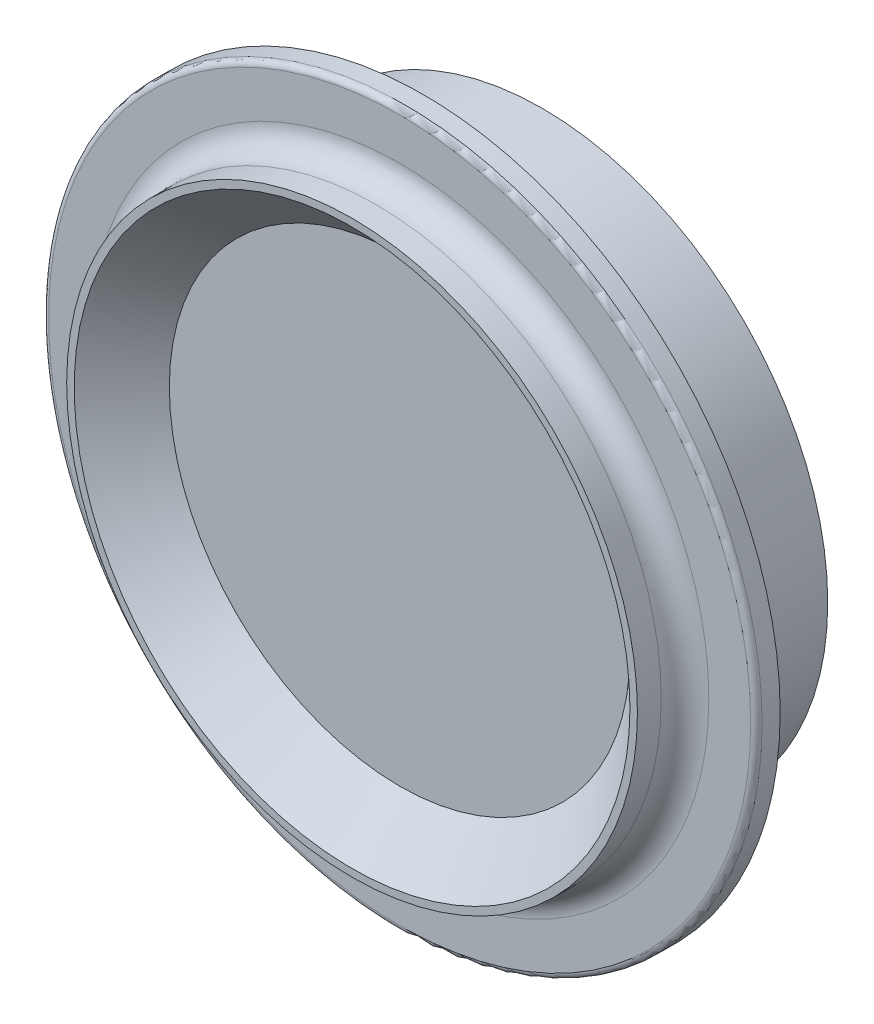
ISO-10303-21;
HEADER;
FILE_DESCRIPTION(('STEP AP214'),'2;1');
FILE_NAME('part.step','',(''),(''),'','','');
FILE_SCHEMA(('AUTOMOTIVE_DESIGN { 1 0 10303 214 1 1 1 1 }'));
ENDSEC;
DATA;
#1=APPLICATION_CONTEXT('core data for automotive mechanical design processes');
#2=APPLICATION_PROTOCOL_DEFINITION('international standard','automotive_design',2000,#1);
#3=PRODUCT_CONTEXT('',#1,'mechanical');
#4=PRODUCT('Part','Part','',(#3));
#5=PRODUCT_RELATED_PRODUCT_CATEGORY('part','',(#4));
#6=PRODUCT_DEFINITION_FORMATION('','',#4);
#7=PRODUCT_DEFINITION_CONTEXT('part definition',#1,'design');
#8=PRODUCT_DEFINITION('design','',#6,#7);
#9=PRODUCT_DEFINITION_SHAPE('','',#8);
#10=(LENGTH_UNIT() NAMED_UNIT(*) SI_UNIT(.MILLI.,.METRE.));
#11=(NAMED_UNIT(*) PLANE_ANGLE_UNIT() SI_UNIT($,.RADIAN.));
#12=(NAMED_UNIT(*) SI_UNIT($,.STERADIAN.) SOLID_ANGLE_UNIT());
#13=UNCERTAINTY_MEASURE_WITH_UNIT(LENGTH_MEASURE(1.E-05),#10,'distance_accuracy_value','');
#14=(GEOMETRIC_REPRESENTATION_CONTEXT(3) GLOBAL_UNCERTAINTY_ASSIGNED_CONTEXT((#13)) GLOBAL_UNIT_ASSIGNED_CONTEXT((#10,
#11,#12)) REPRESENTATION_CONTEXT('',''));
#15=CARTESIAN_POINT('',(0.,0.,0.));
#16=DIRECTION('',(0.,0.,1.));
#17=DIRECTION('',(1.,0.,0.));
#18=AXIS2_PLACEMENT_3D('',#15,#16,#17);
#19=CARTESIAN_POINT('',(332.784130452431,254.345130463396,-25.4));
#20=DIRECTION('',(0.,0.,1.));
#21=DIRECTION('',(1.,0.,0.));
#22=AXIS2_PLACEMENT_3D('',#19,#20,#21);
#23=CYLINDRICAL_SURFACE('',#22,38.0927495344997);
#24=CARTESIAN_POINT('',(332.784130452431,254.345130463396,-3.175));
#25=DIRECTION('',(0.,0.,1.));
#26=DIRECTION('',(1.,0.,0.));
#27=AXIS2_PLACEMENT_3D('',#24,#25,#26);
#28=CIRCLE('',#27,38.0927495344997);
#29=CARTESIAN_POINT('',(370.87687998693,254.345130463396,-3.175));
#30=VERTEX_POINT('',#29);
#31=EDGE_CURVE('E41',#30,#30,#28,.T.);
#32=ORIENTED_EDGE('',*,*,#31,.T.);
#33=EDGE_LOOP('',(#32));
#34=FACE_BOUND('',#33,.T.);
#35=CARTESIAN_POINT('',(332.784130452431,254.345130463396,0.));
#36=DIRECTION('',(0.,0.,1.));
#37=DIRECTION('',(1.,0.,0.));
#38=AXIS2_PLACEMENT_3D('',#35,#36,#37);
#39=CIRCLE('',#38,38.0927495344997);
#40=CARTESIAN_POINT('',(370.87687998693,254.345130463396,0.));
#41=VERTEX_POINT('',#40);
#42=EDGE_CURVE('E54',#41,#41,#39,.T.);
#43=ORIENTED_EDGE('',*,*,#42,.F.);
#44=EDGE_LOOP('',(#43));
#45=FACE_BOUND('',#44,.T.);
#46=ADVANCED_FACE('F30',(#34,#45),#23,.T.);
#47=CARTESIAN_POINT('',(332.784130452431,254.345130463396,0.));
#48=DIRECTION('',(0.,0.,1.));
#49=DIRECTION('',(1.,0.,0.));
#50=AXIS2_PLACEMENT_3D('',#47,#48,#49);
#51=PLANE('',#50);
#52=CARTESIAN_POINT('',(332.784130452431,254.345130463396,0.));
#53=DIRECTION('',(0.,0.,1.));
#54=DIRECTION('',(1.,0.,0.));
#55=AXIS2_PLACEMENT_3D('',#52,#53,#54);
#56=CIRCLE('',#55,37.0909120800306);
#57=CARTESIAN_POINT('',(369.875042532461,254.345130463396,0.));
#58=VERTEX_POINT('',#57);
#59=EDGE_CURVE('E57',#58,#58,#56,.T.);
#60=ORIENTED_EDGE('',*,*,#59,.F.);
#61=EDGE_LOOP('',(#60));
#62=FACE_BOUND('',#61,.T.);
#63=ORIENTED_EDGE('',*,*,#42,.T.);
#64=EDGE_LOOP('',(#63));
#65=FACE_BOUND('',#64,.T.);
#66=ADVANCED_FACE('F89',(#62,#65),#51,.T.);
#67=CARTESIAN_POINT('',(332.784130452431,254.345130463396,-6.35));
#68=DIRECTION('',(0.,0.,1.));
#69=DIRECTION('',(1.,0.,0.));
#70=AXIS2_PLACEMENT_3D('',#67,#68,#69);
#71=PLANE('',#70);
#72=CARTESIAN_POINT('',(332.784130452431,254.345130463396,-6.35));
#73=DIRECTION('',(0.,0.,1.));
#74=DIRECTION('',(1.,0.,0.));
#75=AXIS2_PLACEMENT_3D('',#72,#73,#74);
#76=CIRCLE('',#75,30.7409120800305);
#77=CARTESIAN_POINT('',(363.525042532461,254.345130463396,-6.35));
#78=VERTEX_POINT('',#77);
#79=EDGE_CURVE('E50',#78,#78,#76,.T.);
#80=ORIENTED_EDGE('',*,*,#79,.T.);
#81=EDGE_LOOP('',(#80));
#82=FACE_BOUND('',#81,.T.);
#83=ADVANCED_FACE('F94',(#82),#71,.T.);
#84=CARTESIAN_POINT('',(332.784130452431,254.345130463396,-6.35));
#85=DIRECTION('',(0.,0.,1.));
#86=DIRECTION('',(1.,0.,0.));
#87=AXIS2_PLACEMENT_3D('',#84,#85,#86);
#88=CONICAL_SURFACE('',#87,30.7409120800305,0.785398163397452);
#89=ORIENTED_EDGE('',*,*,#59,.T.);
#90=EDGE_LOOP('',(#89));
#91=FACE_BOUND('',#90,.T.);
#92=ORIENTED_EDGE('',*,*,#79,.F.);
#93=EDGE_LOOP('',(#92));
#94=FACE_BOUND('',#93,.T.);
#95=ADVANCED_FACE('F113',(#91,#94),#88,.F.);
#96=CARTESIAN_POINT('',(332.784130452431,254.345130463396,-9.525));
#97=DIRECTION('',(0.,0.,1.));
#98=DIRECTION('',(1.,0.,0.));
#99=AXIS2_PLACEMENT_3D('',#96,#97,#98);
#100=CYLINDRICAL_SURFACE('',#99,47.61774957);
#101=CARTESIAN_POINT('',(332.784130452431,254.345130463396,-7.112));
#102=DIRECTION('',(0.,0.,1.));
#103=DIRECTION('',(1.,0.,0.));
#104=AXIS2_PLACEMENT_3D('',#101,#102,#103);
#105=CIRCLE('',#104,47.61774957);
#106=CARTESIAN_POINT('',(380.401880022431,254.345130463396,-7.112));
#107=VERTEX_POINT('',#106);
#108=EDGE_CURVE('E10',#107,#107,#105,.F.);
#109=ORIENTED_EDGE('',*,*,#108,.T.);
#110=EDGE_LOOP('',(#109));
#111=FACE_BOUND('',#110,.T.);
#112=CARTESIAN_POINT('',(332.784130452431,254.345130463396,-9.525));
#113=DIRECTION('',(0.,0.,1.));
#114=DIRECTION('',(1.,0.,0.));
#115=AXIS2_PLACEMENT_3D('',#112,#113,#114);
#116=CIRCLE('',#115,47.61774957);
#117=CARTESIAN_POINT('',(380.401880022431,254.345130463396,-9.525));
#118=VERTEX_POINT('',#117);
#119=EDGE_CURVE('E62',#118,#118,#116,.T.);
#120=ORIENTED_EDGE('',*,*,#119,.T.);
#121=EDGE_LOOP('',(#120));
#122=FACE_BOUND('',#121,.T.);
#123=ADVANCED_FACE('F108',(#111,#122),#100,.T.);
#124=CARTESIAN_POINT('',(332.784130452431,254.345130463396,-9.525));
#125=DIRECTION('',(0.,0.,1.));
#126=DIRECTION('',(1.,0.,0.));
#127=AXIS2_PLACEMENT_3D('',#124,#125,#126);
#128=PLANE('',#127);
#129=CARTESIAN_POINT('',(332.784130452431,254.345130463396,-9.525));
#130=DIRECTION('',(0.,0.,1.));
#131=DIRECTION('',(1.,0.,0.));
#132=AXIS2_PLACEMENT_3D('',#129,#130,#131);
#133=CIRCLE('',#132,38.0927495344997);
#134=CARTESIAN_POINT('',(370.87687998693,254.345130463396,-9.525));
#135=VERTEX_POINT('',#134);
#136=EDGE_CURVE('E65',#135,#135,#133,.T.);
#137=ORIENTED_EDGE('',*,*,#136,.T.);
#138=EDGE_LOOP('',(#137));
#139=FACE_BOUND('',#138,.T.);
#140=ORIENTED_EDGE('',*,*,#119,.F.);
#141=EDGE_LOOP('',(#140));
#142=FACE_BOUND('',#141,.T.);
#143=ADVANCED_FACE('F69',(#139,#142),#128,.F.);
#144=CARTESIAN_POINT('',(332.784130452431,254.345130463396,-6.35));
#145=DIRECTION('',(0.,0.,1.));
#146=DIRECTION('',(1.,0.,0.));
#147=AXIS2_PLACEMENT_3D('',#144,#145,#146);
#148=PLANE('',#147);
#149=CARTESIAN_POINT('',(332.784130452431,254.345130463396,-6.35));
#150=DIRECTION('',(0.,0.,1.));
#151=DIRECTION('',(1.,0.,0.));
#152=AXIS2_PLACEMENT_3D('',#149,#150,#151);
#153=CIRCLE('',#152,46.85574957);
#154=CARTESIAN_POINT('',(379.639880022431,254.345130463396,-6.35));
#155=VERTEX_POINT('',#154);
#156=EDGE_CURVE('E37',#155,#155,#153,.T.);
#157=ORIENTED_EDGE('',*,*,#156,.T.);
#158=EDGE_LOOP('',(#157));
#159=FACE_BOUND('',#158,.T.);
#160=CARTESIAN_POINT('',(332.784130452431,254.345130463396,-6.35));
#161=DIRECTION('',(0.,0.,1.));
#162=DIRECTION('',(1.,0.,0.));
#163=AXIS2_PLACEMENT_3D('',#160,#161,#162);
#164=CIRCLE('',#163,41.2677495344997);
#165=CARTESIAN_POINT('',(374.05187998693,254.345130463396,-6.35));
#166=VERTEX_POINT('',#165);
#167=EDGE_CURVE('E45',#166,#166,#164,.F.);
#168=ORIENTED_EDGE('',*,*,#167,.T.);
#169=EDGE_LOOP('',(#168));
#170=FACE_BOUND('',#169,.T.);
#171=ADVANCED_FACE('F83',(#159,#170),#148,.T.);
#172=CARTESIAN_POINT('',(332.784130452431,254.345130463396,-25.4));
#173=DIRECTION('',(0.,0.,1.));
#174=DIRECTION('',(1.,0.,0.));
#175=AXIS2_PLACEMENT_3D('',#172,#173,#174);
#176=PLANE('',#175);
#177=CARTESIAN_POINT('',(332.784130452431,254.345130463396,-25.4));
#178=DIRECTION('',(0.,0.,1.));
#179=DIRECTION('',(1.,0.,0.));
#180=AXIS2_PLACEMENT_3D('',#177,#178,#179);
#181=CIRCLE('',#180,38.0927495344997);
#182=CARTESIAN_POINT('',(370.87687998693,254.345130463396,-25.4));
#183=VERTEX_POINT('',#182);
#184=EDGE_CURVE('E53',#183,#183,#181,.T.);
#185=ORIENTED_EDGE('',*,*,#184,.F.);
#186=EDGE_LOOP('',(#185));
#187=FACE_BOUND('',#186,.T.);
#188=ADVANCED_FACE('F75',(#187),#176,.F.);
#189=ORIENTED_EDGE('',*,*,#184,.T.);
#190=EDGE_LOOP('',(#189));
#191=FACE_BOUND('',#190,.T.);
#192=ORIENTED_EDGE('',*,*,#136,.F.);
#193=EDGE_LOOP('',(#192));
#194=FACE_BOUND('',#193,.T.);
#195=ADVANCED_FACE('F72',(#191,#194),#23,.T.);
#196=CARTESIAN_POINT('',(332.784130452431,254.345130463396,-3.175));
#197=DIRECTION('',(0.,0.,1.));
#198=DIRECTION('',(1.,0.,0.));
#199=AXIS2_PLACEMENT_3D('',#196,#197,#198);
#200=TOROIDAL_SURFACE('',#199,41.2677495344997,3.175);
#201=ORIENTED_EDGE('',*,*,#31,.F.);
#202=EDGE_LOOP('',(#201));
#203=FACE_BOUND('',#202,.T.);
#204=ORIENTED_EDGE('',*,*,#167,.F.);
#205=EDGE_LOOP('',(#204));
#206=FACE_BOUND('',#205,.T.);
#207=ADVANCED_FACE('F74',(#203,#206),#200,.F.);
#208=CARTESIAN_POINT('',(332.784130452431,254.345130463396,-7.112));
#209=DIRECTION('',(0.,0.,1.));
#210=DIRECTION('',(1.,0.,0.));
#211=AXIS2_PLACEMENT_3D('',#208,#209,#210);
#212=TOROIDAL_SURFACE('',#211,46.85574957,0.762);
#213=ORIENTED_EDGE('',*,*,#108,.F.);
#214=EDGE_LOOP('',(#213));
#215=FACE_BOUND('',#214,.T.);
#216=ORIENTED_EDGE('',*,*,#156,.F.);
#217=EDGE_LOOP('',(#216));
#218=FACE_BOUND('',#217,.T.);
#219=ADVANCED_FACE('F32',(#215,#218),#212,.T.);
#220=CLOSED_SHELL('',(#46,#66,#83,#95,#123,#143,#171,#188,#195,#207,#219));
#221=MANIFOLD_SOLID_BREP('B2',#220);
#222=ADVANCED_BREP_SHAPE_REPRESENTATION('',(#18,#221),#14);
#223=SHAPE_DEFINITION_REPRESENTATION(#9,#222);
ENDSEC;
END-ISO-10303-21;
